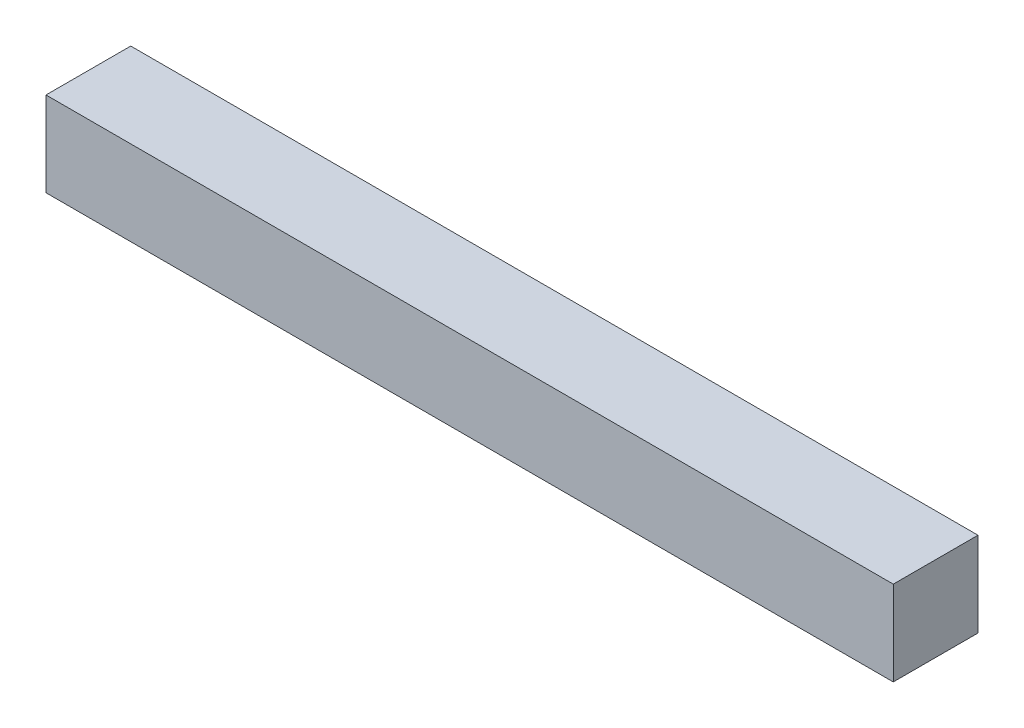
ISO-10303-21;
HEADER;
FILE_DESCRIPTION(('STEP AP214'),'2;1');
FILE_NAME('part.step','',(''),(''),'','','');
FILE_SCHEMA(('AUTOMOTIVE_DESIGN { 1 0 10303 214 1 1 1 1 }'));
ENDSEC;
DATA;
#1=APPLICATION_CONTEXT('core data for automotive mechanical design processes');
#2=APPLICATION_PROTOCOL_DEFINITION('international standard','automotive_design',2000,#1);
#3=PRODUCT_CONTEXT('',#1,'mechanical');
#4=PRODUCT('Part','Part','',(#3));
#5=PRODUCT_RELATED_PRODUCT_CATEGORY('part','',(#4));
#6=PRODUCT_DEFINITION_FORMATION('','',#4);
#7=PRODUCT_DEFINITION_CONTEXT('part definition',#1,'design');
#8=PRODUCT_DEFINITION('design','',#6,#7);
#9=PRODUCT_DEFINITION_SHAPE('','',#8);
#10=(LENGTH_UNIT() NAMED_UNIT(*) SI_UNIT(.MILLI.,.METRE.));
#11=(NAMED_UNIT(*) PLANE_ANGLE_UNIT() SI_UNIT($,.RADIAN.));
#12=(NAMED_UNIT(*) SI_UNIT($,.STERADIAN.) SOLID_ANGLE_UNIT());
#13=UNCERTAINTY_MEASURE_WITH_UNIT(LENGTH_MEASURE(1.E-05),#10,'distance_accuracy_value','');
#14=(GEOMETRIC_REPRESENTATION_CONTEXT(3) GLOBAL_UNCERTAINTY_ASSIGNED_CONTEXT((#13)) GLOBAL_UNIT_ASSIGNED_CONTEXT((#10,
#11,#12)) REPRESENTATION_CONTEXT('',''));
#15=CARTESIAN_POINT('',(0.,0.,0.));
#16=DIRECTION('',(0.,0.,1.));
#17=DIRECTION('',(1.,0.,0.));
#18=AXIS2_PLACEMENT_3D('',#15,#16,#17);
#19=CARTESIAN_POINT('',(200.,500.,-750.));
#20=DIRECTION('',(-1.,0.,0.));
#21=DIRECTION('',(0.,0.,1.));
#22=AXIS2_PLACEMENT_3D('',#19,#20,#21);
#23=PLANE('',#22);
#24=DIRECTION('',(0.,-1.,0.));
#25=VECTOR('',#24,1.);
#26=CARTESIAN_POINT('',(200.,500.,-650.));
#27=LINE('',#26,#25);
#28=CARTESIAN_POINT('',(200.,600.,-650.));
#29=VERTEX_POINT('',#28);
#30=CARTESIAN_POINT('',(200.,500.,-650.));
#31=VERTEX_POINT('',#30);
#32=EDGE_CURVE('E103',#29,#31,#27,.T.);
#33=ORIENTED_EDGE('',*,*,#32,.F.);
#34=DIRECTION('',(0.,0.,1.));
#35=VECTOR('',#34,1.);
#36=CARTESIAN_POINT('',(200.,600.,-750.));
#37=LINE('',#36,#35);
#38=CARTESIAN_POINT('',(200.,600.,-750.));
#39=VERTEX_POINT('',#38);
#40=EDGE_CURVE('E11',#39,#29,#37,.T.);
#41=ORIENTED_EDGE('',*,*,#40,.F.);
#42=DIRECTION('',(0.,-1.,0.));
#43=VECTOR('',#42,1.);
#44=CARTESIAN_POINT('',(200.,500.,-750.));
#45=LINE('',#44,#43);
#46=CARTESIAN_POINT('',(200.,500.,-750.));
#47=VERTEX_POINT('',#46);
#48=EDGE_CURVE('E97',#39,#47,#45,.T.);
#49=ORIENTED_EDGE('',*,*,#48,.T.);
#50=DIRECTION('',(0.,0.,1.));
#51=VECTOR('',#50,1.);
#52=CARTESIAN_POINT('',(200.,500.,-750.));
#53=LINE('',#52,#51);
#54=EDGE_CURVE('E42',#47,#31,#53,.T.);
#55=ORIENTED_EDGE('',*,*,#54,.T.);
#56=EDGE_LOOP('',(#33,#41,#49,#55));
#57=FACE_BOUND('',#56,.T.);
#58=ADVANCED_FACE('F39',(#57),#23,.T.);
#59=CARTESIAN_POINT('',(200.,600.,-750.));
#60=DIRECTION('',(0.,1.,0.));
#61=DIRECTION('',(0.,0.,1.));
#62=AXIS2_PLACEMENT_3D('',#59,#60,#61);
#63=PLANE('',#62);
#64=DIRECTION('',(-1.,0.,0.));
#65=VECTOR('',#64,1.);
#66=CARTESIAN_POINT('',(200.,600.,-650.));
#67=LINE('',#66,#65);
#68=CARTESIAN_POINT('',(1200.,600.,-650.));
#69=VERTEX_POINT('',#68);
#70=EDGE_CURVE('E99',#69,#29,#67,.T.);
#71=ORIENTED_EDGE('',*,*,#70,.F.);
#72=DIRECTION('',(0.,0.,1.));
#73=VECTOR('',#72,1.);
#74=CARTESIAN_POINT('',(1200.,600.,-750.));
#75=LINE('',#74,#73);
#76=CARTESIAN_POINT('',(1200.,600.,-750.));
#77=VERTEX_POINT('',#76);
#78=EDGE_CURVE('E48',#77,#69,#75,.T.);
#79=ORIENTED_EDGE('',*,*,#78,.F.);
#80=DIRECTION('',(-1.,0.,0.));
#81=VECTOR('',#80,1.);
#82=CARTESIAN_POINT('',(200.,600.,-750.));
#83=LINE('',#82,#81);
#84=EDGE_CURVE('E94',#77,#39,#83,.T.);
#85=ORIENTED_EDGE('',*,*,#84,.T.);
#86=ORIENTED_EDGE('',*,*,#40,.T.);
#87=EDGE_LOOP('',(#71,#79,#85,#86));
#88=FACE_BOUND('',#87,.T.);
#89=ADVANCED_FACE('F113',(#88),#63,.T.);
#90=CARTESIAN_POINT('',(1200.,500.,-750.));
#91=DIRECTION('',(1.,0.,0.));
#92=DIRECTION('',(0.,0.,-1.));
#93=AXIS2_PLACEMENT_3D('',#90,#91,#92);
#94=PLANE('',#93);
#95=DIRECTION('',(0.,1.,0.));
#96=VECTOR('',#95,1.);
#97=CARTESIAN_POINT('',(1200.,500.,-650.));
#98=LINE('',#97,#96);
#99=CARTESIAN_POINT('',(1200.,500.,-650.));
#100=VERTEX_POINT('',#99);
#101=EDGE_CURVE('E89',#100,#69,#98,.T.);
#102=ORIENTED_EDGE('',*,*,#101,.F.);
#103=DIRECTION('',(0.,0.,1.));
#104=VECTOR('',#103,1.);
#105=CARTESIAN_POINT('',(1200.,500.,-750.));
#106=LINE('',#105,#104);
#107=CARTESIAN_POINT('',(1200.,500.,-750.));
#108=VERTEX_POINT('',#107);
#109=EDGE_CURVE('E84',#108,#100,#106,.T.);
#110=ORIENTED_EDGE('',*,*,#109,.F.);
#111=DIRECTION('',(0.,1.,0.));
#112=VECTOR('',#111,1.);
#113=CARTESIAN_POINT('',(1200.,500.,-750.));
#114=LINE('',#113,#112);
#115=EDGE_CURVE('E87',#108,#77,#114,.T.);
#116=ORIENTED_EDGE('',*,*,#115,.T.);
#117=ORIENTED_EDGE('',*,*,#78,.T.);
#118=EDGE_LOOP('',(#102,#110,#116,#117));
#119=FACE_BOUND('',#118,.T.);
#120=ADVANCED_FACE('F86',(#119),#94,.T.);
#121=CARTESIAN_POINT('',(200.,500.,-750.));
#122=DIRECTION('',(0.,-1.,0.));
#123=DIRECTION('',(0.,0.,-1.));
#124=AXIS2_PLACEMENT_3D('',#121,#122,#123);
#125=PLANE('',#124);
#126=DIRECTION('',(1.,0.,0.));
#127=VECTOR('',#126,1.);
#128=CARTESIAN_POINT('',(200.,500.,-650.));
#129=LINE('',#128,#127);
#130=EDGE_CURVE('E106',#31,#100,#129,.T.);
#131=ORIENTED_EDGE('',*,*,#130,.F.);
#132=ORIENTED_EDGE('',*,*,#54,.F.);
#133=DIRECTION('',(1.,0.,0.));
#134=VECTOR('',#133,1.);
#135=CARTESIAN_POINT('',(200.,500.,-750.));
#136=LINE('',#135,#134);
#137=EDGE_CURVE('E93',#47,#108,#136,.T.);
#138=ORIENTED_EDGE('',*,*,#137,.T.);
#139=ORIENTED_EDGE('',*,*,#109,.T.);
#140=EDGE_LOOP('',(#131,#132,#138,#139));
#141=FACE_BOUND('',#140,.T.);
#142=ADVANCED_FACE('F96',(#141),#125,.T.);
#143=CARTESIAN_POINT('',(0.,0.,-750.));
#144=DIRECTION('',(0.,0.,-1.));
#145=DIRECTION('',(-1.,0.,0.));
#146=AXIS2_PLACEMENT_3D('',#143,#144,#145);
#147=PLANE('',#146);
#148=ORIENTED_EDGE('',*,*,#48,.F.);
#149=ORIENTED_EDGE('',*,*,#84,.F.);
#150=ORIENTED_EDGE('',*,*,#115,.F.);
#151=ORIENTED_EDGE('',*,*,#137,.F.);
#152=EDGE_LOOP('',(#148,#149,#150,#151));
#153=FACE_BOUND('',#152,.T.);
#154=ADVANCED_FACE('F92',(#153),#147,.T.);
#155=CARTESIAN_POINT('',(0.,0.,-650.));
#156=DIRECTION('',(0.,0.,-1.));
#157=DIRECTION('',(-1.,0.,0.));
#158=AXIS2_PLACEMENT_3D('',#155,#156,#157);
#159=PLANE('',#158);
#160=ORIENTED_EDGE('',*,*,#32,.T.);
#161=ORIENTED_EDGE('',*,*,#130,.T.);
#162=ORIENTED_EDGE('',*,*,#101,.T.);
#163=ORIENTED_EDGE('',*,*,#70,.T.);
#164=EDGE_LOOP('',(#160,#161,#162,#163));
#165=FACE_BOUND('',#164,.T.);
#166=ADVANCED_FACE('F112',(#165),#159,.F.);
#167=CLOSED_SHELL('',(#58,#89,#120,#142,#154,#166));
#168=MANIFOLD_SOLID_BREP('B2',#167);
#169=ADVANCED_BREP_SHAPE_REPRESENTATION('',(#18,#168),#14);
#170=SHAPE_DEFINITION_REPRESENTATION(#9,#169);
ENDSEC;
END-ISO-10303-21;
